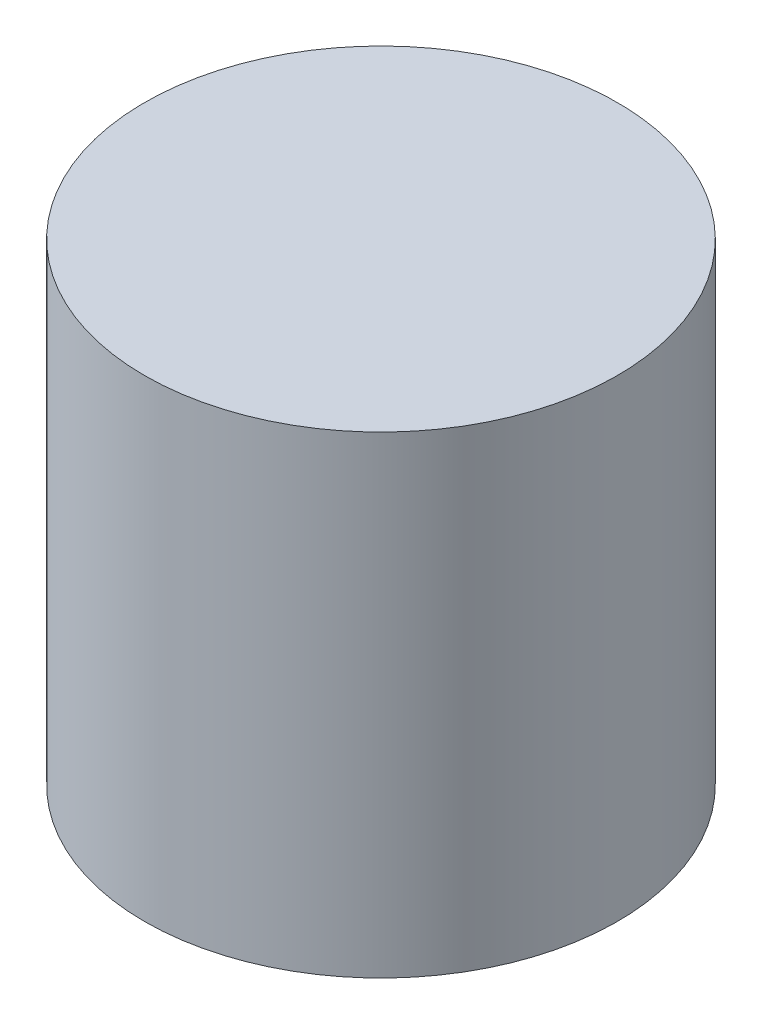
ISO-10303-21;
HEADER;
FILE_DESCRIPTION(('STEP AP214'),'2;1');
FILE_NAME('part.step','',(''),(''),'','','');
FILE_SCHEMA(('AUTOMOTIVE_DESIGN { 1 0 10303 214 1 1 1 1 }'));
ENDSEC;
DATA;
#1=APPLICATION_CONTEXT('core data for automotive mechanical design processes');
#2=APPLICATION_PROTOCOL_DEFINITION('international standard','automotive_design',2000,#1);
#3=PRODUCT_CONTEXT('',#1,'mechanical');
#4=PRODUCT('Part','Part','',(#3));
#5=PRODUCT_RELATED_PRODUCT_CATEGORY('part','',(#4));
#6=PRODUCT_DEFINITION_FORMATION('','',#4);
#7=PRODUCT_DEFINITION_CONTEXT('part definition',#1,'design');
#8=PRODUCT_DEFINITION('design','',#6,#7);
#9=PRODUCT_DEFINITION_SHAPE('','',#8);
#10=(LENGTH_UNIT() NAMED_UNIT(*) SI_UNIT(.MILLI.,.METRE.));
#11=(NAMED_UNIT(*) PLANE_ANGLE_UNIT() SI_UNIT($,.RADIAN.));
#12=(NAMED_UNIT(*) SI_UNIT($,.STERADIAN.) SOLID_ANGLE_UNIT());
#13=UNCERTAINTY_MEASURE_WITH_UNIT(LENGTH_MEASURE(1.E-05),#10,'distance_accuracy_value','');
#14=(GEOMETRIC_REPRESENTATION_CONTEXT(3) GLOBAL_UNCERTAINTY_ASSIGNED_CONTEXT((#13)) GLOBAL_UNIT_ASSIGNED_CONTEXT((#10,
#11,#12)) REPRESENTATION_CONTEXT('',''));
#15=CARTESIAN_POINT('',(0.,0.,0.));
#16=DIRECTION('',(0.,0.,1.));
#17=DIRECTION('',(1.,0.,0.));
#18=AXIS2_PLACEMENT_3D('',#15,#16,#17);
#19=CARTESIAN_POINT('',(0.,15.,0.));
#20=DIRECTION('',(0.,-1.,0.));
#21=DIRECTION('',(0.,0.,-1.));
#22=AXIS2_PLACEMENT_3D('',#19,#20,#21);
#23=CYLINDRICAL_SURFACE('',#22,7.5);
#24=CARTESIAN_POINT('',(0.,15.,0.));
#25=DIRECTION('',(0.,1.,0.));
#26=DIRECTION('',(0.,0.,1.));
#27=AXIS2_PLACEMENT_3D('',#24,#25,#26);
#28=CIRCLE('',#27,7.5);
#29=CARTESIAN_POINT('',(0.,15.,7.5));
#30=VERTEX_POINT('',#29);
#31=EDGE_CURVE('E10',#30,#30,#28,.T.);
#32=ORIENTED_EDGE('',*,*,#31,.F.);
#33=EDGE_LOOP('',(#32));
#34=FACE_BOUND('',#33,.T.);
#35=CARTESIAN_POINT('',(0.,0.,0.));
#36=DIRECTION('',(0.,1.,0.));
#37=DIRECTION('',(0.,0.,1.));
#38=AXIS2_PLACEMENT_3D('',#35,#36,#37);
#39=CIRCLE('',#38,7.5);
#40=CARTESIAN_POINT('',(0.,0.,7.5));
#41=VERTEX_POINT('',#40);
#42=EDGE_CURVE('E34',#41,#41,#39,.T.);
#43=ORIENTED_EDGE('',*,*,#42,.T.);
#44=EDGE_LOOP('',(#43));
#45=FACE_BOUND('',#44,.T.);
#46=ADVANCED_FACE('F31',(#34,#45),#23,.T.);
#47=CARTESIAN_POINT('',(0.,15.,0.));
#48=DIRECTION('',(0.,1.,0.));
#49=DIRECTION('',(0.,0.,1.));
#50=AXIS2_PLACEMENT_3D('',#47,#48,#49);
#51=PLANE('',#50);
#52=ORIENTED_EDGE('',*,*,#31,.T.);
#53=EDGE_LOOP('',(#52));
#54=FACE_BOUND('',#53,.T.);
#55=ADVANCED_FACE('F46',(#54),#51,.T.);
#56=CARTESIAN_POINT('',(0.,0.,0.));
#57=DIRECTION('',(0.,1.,0.));
#58=DIRECTION('',(0.,0.,1.));
#59=AXIS2_PLACEMENT_3D('',#56,#57,#58);
#60=PLANE('',#59);
#61=ORIENTED_EDGE('',*,*,#42,.F.);
#62=EDGE_LOOP('',(#61));
#63=FACE_BOUND('',#62,.T.);
#64=ADVANCED_FACE('F44',(#63),#60,.F.);
#65=CLOSED_SHELL('',(#46,#55,#64));
#66=MANIFOLD_SOLID_BREP('B2',#65);
#67=ADVANCED_BREP_SHAPE_REPRESENTATION('',(#18,#66),#14);
#68=SHAPE_DEFINITION_REPRESENTATION(#9,#67);
ENDSEC;
END-ISO-10303-21;
